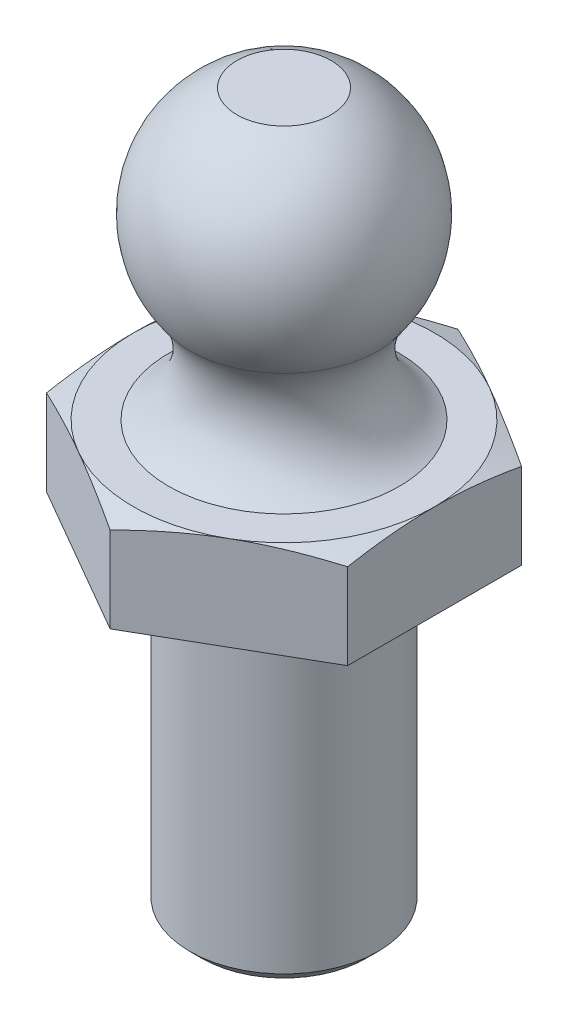
ISO-10303-21;
HEADER;
FILE_DESCRIPTION(('STEP AP214'),'2;1');
FILE_NAME('part.step','',(''),(''),'','','');
FILE_SCHEMA(('AUTOMOTIVE_DESIGN { 1 0 10303 214 1 1 1 1 }'));
ENDSEC;
DATA;
#1=APPLICATION_CONTEXT('core data for automotive mechanical design processes');
#2=APPLICATION_PROTOCOL_DEFINITION('international standard','automotive_design',2000,#1);
#3=PRODUCT_CONTEXT('',#1,'mechanical');
#4=PRODUCT('Part','Part','',(#3));
#5=PRODUCT_RELATED_PRODUCT_CATEGORY('part','',(#4));
#6=PRODUCT_DEFINITION_FORMATION('','',#4);
#7=PRODUCT_DEFINITION_CONTEXT('part definition',#1,'design');
#8=PRODUCT_DEFINITION('design','',#6,#7);
#9=PRODUCT_DEFINITION_SHAPE('','',#8);
#10=(LENGTH_UNIT() NAMED_UNIT(*) SI_UNIT(.MILLI.,.METRE.));
#11=(NAMED_UNIT(*) PLANE_ANGLE_UNIT() SI_UNIT($,.RADIAN.));
#12=(NAMED_UNIT(*) SI_UNIT($,.STERADIAN.) SOLID_ANGLE_UNIT());
#13=UNCERTAINTY_MEASURE_WITH_UNIT(LENGTH_MEASURE(1.E-05),#10,'distance_accuracy_value','');
#14=(GEOMETRIC_REPRESENTATION_CONTEXT(3) GLOBAL_UNCERTAINTY_ASSIGNED_CONTEXT((#13)) GLOBAL_UNIT_ASSIGNED_CONTEXT((#10,
#11,#12)) REPRESENTATION_CONTEXT('',''));
#15=CARTESIAN_POINT('',(0.,0.,0.));
#16=DIRECTION('',(0.,0.,1.));
#17=DIRECTION('',(1.,0.,0.));
#18=AXIS2_PLACEMENT_3D('',#15,#16,#17);
#19=CARTESIAN_POINT('',(0.,4.58936333922042,-193.548));
#20=DIRECTION('',(0.,-1.,0.));
#21=DIRECTION('',(0.,0.,-1.));
#22=AXIS2_PLACEMENT_3D('',#19,#20,#21);
#23=PLANE('',#22);
#24=CARTESIAN_POINT('',(0.,4.58936333922042,-191.563625000001));
#25=CARTESIAN_POINT('',(-0.0557150271613897,4.58936333922042,-191.563625334105));
#26=CARTESIAN_POINT('',(-0.111440293868772,4.58936333922044,-191.565973553882));
#27=CARTESIAN_POINT('',(-0.222505728996802,4.5893633392204,-191.575351160161));
#28=CARTESIAN_POINT('',(-0.277845778848989,4.58936333922033,-191.58238192869));
#29=CARTESIAN_POINT('',(-0.387830036197576,4.58936333922051,-191.601093020423));
#30=CARTESIAN_POINT('',(-0.442472996340412,4.58936333922076,-191.612780724264));
#31=CARTESIAN_POINT('',(-0.550610426029016,4.58936333922008,-191.640725048325));
#32=CARTESIAN_POINT('',(-0.604103925489515,4.58936333921917,-191.656985376249));
#33=CARTESIAN_POINT('',(-0.762058424801336,4.58936333921834,-191.71240089667));
#34=CARTESIAN_POINT('',(-0.864259248372629,4.58936333922034,-191.758236141338));
#35=CARTESIAN_POINT('',(-1.05950239924729,4.5893633392205,-191.866435915959));
#36=CARTESIAN_POINT('',(-1.15254437821291,4.58936333921867,-191.928801074261));
#37=CARTESIAN_POINT('',(-1.28322206445982,4.58936333921933,-192.033334964534));
#38=CARTESIAN_POINT('',(-1.32532503132006,4.58936333922012,-192.07003822172));
#39=CARTESIAN_POINT('',(-1.40625289158326,4.58936333922072,-192.14681978546));
#40=CARTESIAN_POINT('',(-1.44508090640442,4.58936333922052,-192.18689480384));
#41=CARTESIAN_POINT('',(-1.55631282469814,4.58936333922021,-192.311857125379));
#42=CARTESIAN_POINT('',(-1.62349286810965,4.58936333922036,-192.401504351364));
#43=CARTESIAN_POINT('',(-1.74180907533186,4.58936333922047,-192.590756265847));
#44=CARTESIAN_POINT('',(-1.79294584411017,4.58936333922043,-192.690360578693));
#45=CARTESIAN_POINT('',(-1.87778082462843,4.58936333922041,-192.89675165674));
#46=CARTESIAN_POINT('',(-1.91147922261833,4.58936333922042,-193.003538345218));
#47=CARTESIAN_POINT('',(-1.96046714043071,4.58936333922043,-193.221251046382));
#48=CARTESIAN_POINT('',(-1.97575656194144,4.58936333922042,-193.332177081172));
#49=CARTESIAN_POINT('',(-1.98749697381172,4.58936333922042,-193.5550216405));
#50=CARTESIAN_POINT('',(-1.98394796417128,4.58936333922042,-193.666940165039));
#51=CARTESIAN_POINT('',(-1.95810782876371,4.58936333922042,-193.888595130564));
#52=CARTESIAN_POINT('',(-1.93581680308656,4.58936333922042,-193.998331583201));
#53=CARTESIAN_POINT('',(-1.87313840919942,4.58936333922042,-194.212494301612));
#54=CARTESIAN_POINT('',(-1.83275084770853,4.58936333922042,-194.316920510655));
#55=CARTESIAN_POINT('',(-1.73497564480215,4.58936333922042,-194.517557052002));
#56=CARTESIAN_POINT('',(-1.67758736229559,4.58936333922042,-194.6137670743));
#57=CARTESIAN_POINT('',(-1.58010187505837,4.58936333922042,-194.749725528358));
#58=CARTESIAN_POINT('',(-1.54569976982593,4.58936333922042,-194.793658625092));
#59=CARTESIAN_POINT('',(-1.47328789237,4.58936333922042,-194.878518787126));
#60=CARTESIAN_POINT('',(-1.43527467049677,4.58936333922042,-194.919442910443));
#61=CARTESIAN_POINT('',(-1.31630450772369,4.58936333922042,-195.037129325412));
#62=CARTESIAN_POINT('',(-1.23033074208007,4.58936333922042,-195.108925804719));
#63=CARTESIAN_POINT('',(-1.04753774311359,4.58936333922042,-195.237042153092));
#64=CARTESIAN_POINT('',(-0.95071892222504,4.58936333922042,-195.293362610425));
#65=CARTESIAN_POINT('',(-0.799461739080962,4.58936333922042,-195.365068735016));
#66=CARTESIAN_POINT('',(-0.74797296058449,4.58936333922042,-195.386859981829));
#67=CARTESIAN_POINT('',(-0.643370474447544,4.58936333922042,-195.426012361589));
#68=CARTESIAN_POINT('',(-0.590258121116439,4.58936333922042,-195.443377079781));
#69=CARTESIAN_POINT('',(-0.482848831158081,4.58936333922042,-195.473541400576));
#70=CARTESIAN_POINT('',(-0.42855391051418,4.58936333922042,-195.48634821189));
#71=CARTESIAN_POINT('',(-0.319088693754494,4.58936333922042,-195.507344323422));
#72=CARTESIAN_POINT('',(-0.263918660769994,4.58936333922041,-195.515534985558));
#73=CARTESIAN_POINT('',(-0.173885932530527,4.58936333922042,-195.525048560543));
#74=CARTESIAN_POINT('',(-0.139167385842281,4.58936333922042,-195.527795105813));
#75=CARTESIAN_POINT('',(-0.0696338924846435,4.58936333922042,-195.53145842994));
#76=CARTESIAN_POINT('',(-0.0348189458152521,4.58936333922042,-195.532375208797));
#77=CARTESIAN_POINT('',(0.0557150271613863,4.58936333922042,-195.532374665895));
#78=CARTESIAN_POINT('',(0.111440293868767,4.58936333922044,-195.530026446118));
#79=CARTESIAN_POINT('',(0.222505728996797,4.5893633392204,-195.520648839839));
#80=CARTESIAN_POINT('',(0.277845778848985,4.58936333922033,-195.51361807131));
#81=CARTESIAN_POINT('',(0.387830036197573,4.58936333922051,-195.494906979577));
#82=CARTESIAN_POINT('',(0.442472996340409,4.58936333922076,-195.483219275736));
#83=CARTESIAN_POINT('',(0.550610426029014,4.58936333922008,-195.455274951675));
#84=CARTESIAN_POINT('',(0.604103925489514,4.58936333921917,-195.439014623751));
#85=CARTESIAN_POINT('',(0.762058424801334,4.58936333921834,-195.38359910333));
#86=CARTESIAN_POINT('',(0.864259248372627,4.58936333922034,-195.337763858662));
#87=CARTESIAN_POINT('',(1.05950239924729,4.5893633392205,-195.229564084041));
#88=CARTESIAN_POINT('',(1.15254437821291,4.58936333921866,-195.167198925739));
#89=CARTESIAN_POINT('',(1.28322206445983,4.58936333921933,-195.062665035466));
#90=CARTESIAN_POINT('',(1.32532503132008,4.58936333922012,-195.02596177828));
#91=CARTESIAN_POINT('',(1.40625289158329,4.58936333922072,-194.94918021454));
#92=CARTESIAN_POINT('',(1.44508090640445,4.58936333922052,-194.90910519616));
#93=CARTESIAN_POINT('',(1.55631282469816,4.58936333922021,-194.784142874621));
#94=CARTESIAN_POINT('',(1.62349286810966,4.58936333922036,-194.694495648636));
#95=CARTESIAN_POINT('',(1.74180907533186,4.58936333922048,-194.505243734152));
#96=CARTESIAN_POINT('',(1.79294584411017,4.58936333922043,-194.405639421307));
#97=CARTESIAN_POINT('',(1.87778082462844,4.58936333922041,-194.19924834326));
#98=CARTESIAN_POINT('',(1.91147922261833,4.58936333922042,-194.092461654782));
#99=CARTESIAN_POINT('',(1.96046714043071,4.58936333922043,-193.874748953618));
#100=CARTESIAN_POINT('',(1.97575656194144,4.58936333922042,-193.763822918828));
#101=CARTESIAN_POINT('',(1.98749697381172,4.58936333922042,-193.5409783595));
#102=CARTESIAN_POINT('',(1.98394796417128,4.58936333922042,-193.429059834961));
#103=CARTESIAN_POINT('',(1.95810782876371,4.58936333922042,-193.207404869436));
#104=CARTESIAN_POINT('',(1.93581680308656,4.58936333922042,-193.097668416799));
#105=CARTESIAN_POINT('',(1.87313840919942,4.58936333922042,-192.883505698388));
#106=CARTESIAN_POINT('',(1.83275084770853,4.58936333922042,-192.779079489345));
#107=CARTESIAN_POINT('',(1.73497564480215,4.58936333922042,-192.578442947998));
#108=CARTESIAN_POINT('',(1.67758736229559,4.58936333922042,-192.4822329257));
#109=CARTESIAN_POINT('',(1.58010187505837,4.58936333922042,-192.346274471642));
#110=CARTESIAN_POINT('',(1.54569976982593,4.58936333922042,-192.302341374908));
#111=CARTESIAN_POINT('',(1.47328789236999,4.58936333922042,-192.217481212874));
#112=CARTESIAN_POINT('',(1.43527467049677,4.58936333922042,-192.176557089557));
#113=CARTESIAN_POINT('',(1.31630450772369,4.58936333922042,-192.058870674588));
#114=CARTESIAN_POINT('',(1.23033074208008,4.58936333922042,-191.98707419528));
#115=CARTESIAN_POINT('',(1.0475377431136,4.58936333922042,-191.858957846908));
#116=CARTESIAN_POINT('',(0.950718922225044,4.58936333922041,-191.802637389575));
#117=CARTESIAN_POINT('',(0.799461739080965,4.58936333922042,-191.730931264984));
#118=CARTESIAN_POINT('',(0.747972960584492,4.58936333922042,-191.709140018171));
#119=CARTESIAN_POINT('',(0.643370474447547,4.58936333922042,-191.669987638411));
#120=CARTESIAN_POINT('',(0.590258121116442,4.58936333922042,-191.652622920219));
#121=CARTESIAN_POINT('',(0.482848831158084,4.58936333922042,-191.622458599424));
#122=CARTESIAN_POINT('',(0.428553910514183,4.58936333922042,-191.60965178811));
#123=CARTESIAN_POINT('',(0.319088693754497,4.58936333922042,-191.588655676578));
#124=CARTESIAN_POINT('',(0.263918660769996,4.58936333922042,-191.580465014442));
#125=CARTESIAN_POINT('',(0.173885932530529,4.58936333922042,-191.570951439457));
#126=CARTESIAN_POINT('',(0.139167385842283,4.58936333922042,-191.568204894187));
#127=CARTESIAN_POINT('',(0.0696338924846447,4.58936333922042,-191.56454157006));
#128=CARTESIAN_POINT('',(0.034818945815252,4.58936333922042,-191.563624791203));
#129=CARTESIAN_POINT('',(0.,4.58936333922042,-191.563625000001));
#130=B_SPLINE_CURVE_WITH_KNOTS('',3,(#24,#25,#26,#27,#28,#29,#30,#31,#32,#33,#34,#35,#36,#37,
#38,#39,#40,#41,#42,#43,#44,#45,#46,#47,#48,#49,#50,#51,#52,#53,#54,#55,#56,#57,#58,#59,#60,#61,
#62,#63,#64,#65,#66,#67,#68,#69,#70,#71,#72,#73,#74,#75,#76,#77,#78,#79,#80,#81,#82,#83,#84,#85,
#86,#87,#88,#89,#90,#91,#92,#93,#94,#95,#96,#97,#98,#99,#100,#101,#102,#103,#104,#105,#106,#107,
#108,#109,#110,#111,#112,#113,#114,#115,#116,#117,#118,#119,#120,#121,#122,#123,#124,#125,#126,
#127,#128,#129),.UNSPECIFIED.,.T.,.F.,(4,2,2,2,2,2,2,2,2,2,2,2,2,2,2,2,2,2,2,2,2,2,2,2,2,2,2,2,
2,2,2,2,2,2,2,2,2,2,2,2,2,2,2,2,2,2,2,2,2,2,2,2,4),(0.,0.167113026850752,0.334275398010994,
0.501703760384196,0.669268275182528,1.00359854453386,1.33794152453783,1.50533207164408,
1.67256122905135,2.00691224859852,2.34125065875884,2.67558549795511,3.00992212263343,
3.34425874731176,3.67859358650808,4.01293199666835,4.34728301621501,4.51451217362211,
4.68190272072821,5.01624570073239,5.350575970084,5.51814048488257,5.68556884725596,
5.85273121841631,6.01984424526719,6.12428105026207,6.22871785525696,6.39583088210771,
6.56299325326795,6.73042161564115,6.89798613043949,7.23231639979082,7.56665937979479,
7.73404992690108,7.90127908430835,8.23563010385551,8.56996851401581,8.90430335321204,
9.23863997789039,9.57297660256872,9.90731144176504,10.2416498519253,10.576000871472,
10.7432300288791,10.9106205759852,11.2449635559894,11.579293825341,11.7468583401395,
11.9142867025129,12.0814490736733,12.2485621005241,12.352998905519,12.4574357105139),.UNSPECIFIED.);
#131=CARTESIAN_POINT('',(0.,4.58936333922042,-191.563625000001));
#132=VERTEX_POINT('',#131);
#133=EDGE_CURVE('E20',#132,#132,#130,.T.);
#134=ORIENTED_EDGE('',*,*,#133,.F.);
#135=EDGE_LOOP('',(#134));
#136=FACE_BOUND('',#135,.T.);
#137=ADVANCED_FACE('F16',(#136),#23,.F.);
#138=CARTESIAN_POINT('',(0.,0.,-193.548));
#139=DIRECTION('',(0.,0.,-1.));
#140=DIRECTION('',(0.,-1.,0.));
#141=AXIS2_PLACEMENT_3D('',#138,#139,#140);
#142=SPHERICAL_SURFACE('',#141,5.00000000000032);
#143=CARTESIAN_POINT('',(0.,0.,-198.548));
#144=VERTEX_POINT('',#143);
#145=VERTEX_LOOP('',#144);
#146=FACE_BOUND('',#145,.T.);
#147=ORIENTED_EDGE('',*,*,#133,.T.);
#148=EDGE_LOOP('',(#147));
#149=FACE_BOUND('',#148,.T.);
#150=CARTESIAN_POINT('',(0.,0.,-188.548));
#151=VERTEX_POINT('',#150);
#152=VERTEX_LOOP('',#151);
#153=FACE_BOUND('',#152,.T.);
#154=CARTESIAN_POINT('',(0.,-3.04122071502537,-193.548));
#155=DIRECTION('',(0.,1.,0.));
#156=DIRECTION('',(0.,0.,1.));
#157=AXIS2_PLACEMENT_3D('',#154,#155,#156);
#158=CIRCLE('',#157,3.96874999999833);
#159=CARTESIAN_POINT('',(0.,-3.04122071502537,-189.579250000002));
#160=VERTEX_POINT('',#159);
#161=EDGE_CURVE('E375',#160,#160,#158,.T.);
#162=ORIENTED_EDGE('',*,*,#161,.T.);
#163=EDGE_LOOP('',(#162));
#164=FACE_BOUND('',#163,.T.);
#165=ADVANCED_FACE('F277',(#146,#149,#153,#164),#142,.T.);
#166=CARTESIAN_POINT('',(0.,-25.4799999999946,-193.548));
#167=DIRECTION('',(0.,1.,0.));
#168=DIRECTION('',(0.,0.,1.));
#169=AXIS2_PLACEMENT_3D('',#166,#167,#168);
#170=PLANE('',#169);
#171=CARTESIAN_POINT('',(0.,-25.4800000000939,-193.548));
#172=DIRECTION('',(0.,1.,0.));
#173=DIRECTION('',(0.,0.,1.));
#174=AXIS2_PLACEMENT_3D('',#171,#172,#173);
#175=CIRCLE('',#174,3.46074999993107);
#176=CARTESIAN_POINT('',(0.,-25.4800000000939,-190.087250000069));
#177=VERTEX_POINT('',#176);
#178=EDGE_CURVE('E373',#177,#177,#175,.T.);
#179=ORIENTED_EDGE('',*,*,#178,.F.);
#180=EDGE_LOOP('',(#179));
#181=FACE_BOUND('',#180,.T.);
#182=ADVANCED_FACE('F271',(#181),#170,.F.);
#183=CARTESIAN_POINT('',(0.,-4.91743762070326,-193.548));
#184=DIRECTION('',(0.,1.,0.));
#185=DIRECTION('',(0.,0.,1.));
#186=AXIS2_PLACEMENT_3D('',#183,#184,#185);
#187=TOROIDAL_SURFACE('',#186,6.29895176409567,2.99166009742984);
#188=ORIENTED_EDGE('',*,*,#161,.F.);
#189=EDGE_LOOP('',(#188));
#190=FACE_BOUND('',#189,.T.);
#191=CARTESIAN_POINT('',(0.,-7.54124999999968,-193.548));
#192=DIRECTION('',(0.,1.,0.));
#193=DIRECTION('',(0.,0.,1.));
#194=AXIS2_PLACEMENT_3D('',#191,#192,#193);
#195=CIRCLE('',#194,4.8617187500006);
#196=CARTESIAN_POINT('',(0.,-7.54124999999968,-188.686281249999));
#197=VERTEX_POINT('',#196);
#198=EDGE_CURVE('E370',#197,#197,#195,.T.);
#199=ORIENTED_EDGE('',*,*,#198,.T.);
#200=EDGE_LOOP('',(#199));
#201=FACE_BOUND('',#200,.T.);
#202=ADVANCED_FACE('F266',(#190,#201),#187,.F.);
#203=CARTESIAN_POINT('',(0.,-24.9720000001616,-193.548));
#204=DIRECTION('',(0.,1.,0.));
#205=DIRECTION('',(0.,0.,1.));
#206=AXIS2_PLACEMENT_3D('',#203,#204,#205);
#207=CONICAL_SURFACE('',#206,3.96874999986335,0.785398163397448);
#208=CARTESIAN_POINT('',(0.,-24.9719999999997,-193.548));
#209=DIRECTION('',(0.,1.,0.));
#210=DIRECTION('',(0.,0.,1.));
#211=AXIS2_PLACEMENT_3D('',#208,#209,#210);
#212=CIRCLE('',#211,3.96875);
#213=CARTESIAN_POINT('',(0.,-24.9719999999997,-189.57925));
#214=VERTEX_POINT('',#213);
#215=EDGE_CURVE('E116',#214,#214,#212,.T.);
#216=ORIENTED_EDGE('',*,*,#215,.F.);
#217=EDGE_LOOP('',(#216));
#218=FACE_BOUND('',#217,.T.);
#219=ORIENTED_EDGE('',*,*,#178,.T.);
#220=EDGE_LOOP('',(#219));
#221=FACE_BOUND('',#220,.T.);
#222=ADVANCED_FACE('F262',(#218,#221),#207,.T.);
#223=CARTESIAN_POINT('',(0.,-7.54124999999968,-199.898));
#224=DIRECTION('',(0.,-1.,0.));
#225=DIRECTION('',(0.,0.,-1.));
#226=AXIS2_PLACEMENT_3D('',#223,#224,#225);
#227=PLANE('',#226);
#228=ORIENTED_EDGE('',*,*,#198,.F.);
#229=EDGE_LOOP('',(#228));
#230=FACE_BOUND('',#229,.T.);
#231=CARTESIAN_POINT('',(0.,-7.54125000001567,-193.548));
#232=DIRECTION('',(0.,-1.,0.));
#233=DIRECTION('',(0.,0.,-1.));
#234=AXIS2_PLACEMENT_3D('',#231,#232,#233);
#235=CIRCLE('',#234,6.35000000003332);
#236=CARTESIAN_POINT('',(-3.17500000000732,-7.54125000000799,-199.047261314041));
#237=VERTEX_POINT('',#236);
#238=CARTESIAN_POINT('',(3.17500000001056,-7.54125000001035,-199.047261314047));
#239=VERTEX_POINT('',#238);
#240=EDGE_CURVE('E94',#237,#239,#235,.T.);
#241=ORIENTED_EDGE('',*,*,#240,.F.);
#242=CARTESIAN_POINT('',(0.,-7.54125000001568,-193.548));
#243=DIRECTION('',(0.,-1.,0.));
#244=DIRECTION('',(0.,0.,-1.));
#245=AXIS2_PLACEMENT_3D('',#242,#243,#244);
#246=CIRCLE('',#245,6.35000000003333);
#247=CARTESIAN_POINT('',(-6.35000000001666,-7.54125000000961,-193.548));
#248=VERTEX_POINT('',#247);
#249=EDGE_CURVE('E105',#248,#237,#246,.T.);
#250=ORIENTED_EDGE('',*,*,#249,.F.);
#251=CARTESIAN_POINT('',(0.,-7.54125000001568,-193.548));
#252=DIRECTION('',(0.,-1.,0.));
#253=DIRECTION('',(0.,0.,-1.));
#254=AXIS2_PLACEMENT_3D('',#251,#252,#253);
#255=CIRCLE('',#254,6.35000000003333);
#256=CARTESIAN_POINT('',(-3.17500000001054,-7.54125000001035,-188.048738685953));
#257=VERTEX_POINT('',#256);
#258=EDGE_CURVE('E360',#257,#248,#255,.T.);
#259=ORIENTED_EDGE('',*,*,#258,.F.);
#260=CARTESIAN_POINT('',(0.,-7.54125000001568,-193.548));
#261=DIRECTION('',(0.,-1.,0.));
#262=DIRECTION('',(0.,0.,-1.));
#263=AXIS2_PLACEMENT_3D('',#260,#261,#262);
#264=CIRCLE('',#263,6.35000000003333);
#265=CARTESIAN_POINT('',(3.17500000000731,-7.541250000008,-188.048738685959));
#266=VERTEX_POINT('',#265);
#267=EDGE_CURVE('E357',#266,#257,#264,.T.);
#268=ORIENTED_EDGE('',*,*,#267,.F.);
#269=CARTESIAN_POINT('',(0.,-7.54125000001568,-193.548));
#270=DIRECTION('',(0.,-1.,0.));
#271=DIRECTION('',(0.,0.,-1.));
#272=AXIS2_PLACEMENT_3D('',#269,#270,#271);
#273=CIRCLE('',#272,6.35000000003333);
#274=CARTESIAN_POINT('',(6.35000000001666,-7.54125000000961,-193.548));
#275=VERTEX_POINT('',#274);
#276=EDGE_CURVE('E113',#275,#266,#273,.T.);
#277=ORIENTED_EDGE('',*,*,#276,.F.);
#278=CARTESIAN_POINT('',(0.,-7.54125000001567,-193.548));
#279=DIRECTION('',(0.,-1.,0.));
#280=DIRECTION('',(0.,0.,-1.));
#281=AXIS2_PLACEMENT_3D('',#278,#279,#280);
#282=CIRCLE('',#281,6.35000000003332);
#283=EDGE_CURVE('E109',#239,#275,#282,.T.);
#284=ORIENTED_EDGE('',*,*,#283,.F.);
#285=EDGE_LOOP('',(#241,#250,#259,#268,#277,#284));
#286=FACE_BOUND('',#285,.T.);
#287=ADVANCED_FACE('F111',(#230,#286),#227,.F.);
#288=CARTESIAN_POINT('',(0.,-7.900940857553,-193.548));
#289=DIRECTION('',(0.,-1.,0.));
#290=DIRECTION('',(0.,0.,-1.));
#291=AXIS2_PLACEMENT_3D('',#288,#289,#290);
#292=CONICAL_SURFACE('',#291,7.33824250912835,1.2217304764048);
#293=CARTESIAN_POINT('',(6.35,-7.89879558408126,-197.21417420935));
#294=CARTESIAN_POINT('',(6.35,-7.8437040782526,-196.911578781239));
#295=CARTESIAN_POINT('',(6.35,-7.79357612425022,-196.607967299446));
#296=CARTESIAN_POINT('',(6.35,-7.70545754541579,-195.999645877072));
#297=CARTESIAN_POINT('',(6.35,-7.66744191965917,-195.694939529318));
#298=CARTESIAN_POINT('',(6.35,-7.6209863334511,-195.236732818807));
#299=CARTESIAN_POINT('',(6.35,-7.6072602755038,-195.083766535003));
#300=CARTESIAN_POINT('',(6.35,-7.58354791663496,-194.777543212957));
#301=CARTESIAN_POINT('',(6.35,-7.57356158821592,-194.624286176861));
#302=CARTESIAN_POINT('',(6.35,-7.55748986822849,-194.317249617812));
#303=CARTESIAN_POINT('',(6.35,-7.55141256242043,-194.163469669104));
#304=CARTESIAN_POINT('',(6.35,-7.54328606380553,-193.855793962154));
#305=CARTESIAN_POINT('',(6.35,-7.54123712793025,-193.701898197151));
#306=CARTESIAN_POINT('',(6.35,-7.54125000000355,-193.548));
#307=B_SPLINE_CURVE_WITH_KNOTS('',3,(#293,#294,#295,#296,#297,#298,#299,#300,#301,#302,#303,
#304,#305,#306),.UNSPECIFIED.,.F.,.F.,(4,2,2,2,2,2,4),(0.,0.922845074626538,1.84377278576178,
2.30447383635189,2.7651714994307,3.2268190706333,3.68849608500749),.UNSPECIFIED.);
#308=CARTESIAN_POINT('',(6.35000000000361,-7.89879558408284,-197.214174209352));
#309=VERTEX_POINT('',#308);
#310=EDGE_CURVE('E122',#309,#275,#307,.T.);
#311=ORIENTED_EDGE('',*,*,#310,.F.);
#312=CARTESIAN_POINT('',(3.17500000000323,-7.54125000000502,-199.047261314034));
#313=CARTESIAN_POINT('',(3.30827974833331,-7.54123712793173,-198.970312215458));
#314=CARTESIAN_POINT('',(3.44155739036092,-7.54328606380703,-198.893364332956));
#315=CARTESIAN_POINT('',(3.70801236870752,-7.55141256242199,-198.739526479481));
#316=CARTESIAN_POINT('',(3.84118971088138,-7.55748986823008,-198.662636505127));
#317=CARTESIAN_POINT('',(4.10709117090895,-7.57356158821761,-198.509118225602));
#318=CARTESIAN_POINT('',(4.23981565747721,-7.5835479166367,-198.432489707554));
#319=CARTESIAN_POINT('',(4.50501283360117,-7.60726027550566,-198.279378046531));
#320=CARTESIAN_POINT('',(4.63748552129824,-7.62098633345303,-198.202894904628));
#321=CARTESIAN_POINT('',(5.03430417278631,-7.66744191966132,-197.973791549372));
#322=CARTESIAN_POINT('',(5.29818761063587,-7.70545754541812,-197.821438375495));
#323=CARTESIAN_POINT('',(5.82500941607965,-7.79357612425293,-197.517277664307));
#324=CARTESIAN_POINT('',(6.0879446721935,-7.84370407825553,-197.36547192341));
#325=CARTESIAN_POINT('',(6.3500000000072,-7.89879558408441,-197.214174209355));
#326=B_SPLINE_CURVE_WITH_KNOTS('',3,(#312,#313,#314,#315,#316,#317,#318,#319,#320,#321,#322,
#323,#324,#325),.UNSPECIFIED.,.F.,.F.,(4,2,2,2,2,2,4),(0.,0.461677014375309,0.923324585579079,
1.38402224865904,1.8447232992503,2.76565101038787,3.68849608501668),.UNSPECIFIED.);
#327=EDGE_CURVE('E119',#239,#309,#326,.T.);
#328=ORIENTED_EDGE('',*,*,#327,.F.);
#329=ORIENTED_EDGE('',*,*,#283,.T.);
#330=EDGE_LOOP('',(#311,#328,#329));
#331=FACE_BOUND('',#330,.T.);
#332=ADVANCED_FACE('F120',(#331),#292,.T.);
#333=CARTESIAN_POINT('',(0.,-7.900940857553,-193.548));
#334=DIRECTION('',(0.,-1.,0.));
#335=DIRECTION('',(0.,0.,-1.));
#336=AXIS2_PLACEMENT_3D('',#333,#334,#335);
#337=CONICAL_SURFACE('',#336,7.33824250912835,1.2217304764048);
#338=CARTESIAN_POINT('',(6.35000000000139,-7.89879558408048,-189.881825790657));
#339=CARTESIAN_POINT('',(6.08794467218763,-7.84370407825149,-189.730528076601));
#340=CARTESIAN_POINT('',(5.82500941607373,-7.79357612424879,-189.578722335704));
#341=CARTESIAN_POINT('',(5.29818761062984,-7.70545754541379,-189.274561624516));
#342=CARTESIAN_POINT('',(5.03430417278024,-7.66744191965691,-189.122208450639));
#343=CARTESIAN_POINT('',(4.63748552129208,-7.62098633344851,-188.893105095383));
#344=CARTESIAN_POINT('',(4.50501283359498,-7.60726027550111,-188.816621953481));
#345=CARTESIAN_POINT('',(4.23981565747096,-7.58354791663209,-188.663510292457));
#346=CARTESIAN_POINT('',(4.10709117090268,-7.57356158821298,-188.586881774409));
#347=CARTESIAN_POINT('',(3.84118971087506,-7.55748986822542,-188.433363494884));
#348=CARTESIAN_POINT('',(3.70801236870117,-7.55141256241731,-188.35647352053));
#349=CARTESIAN_POINT('',(3.44155739035451,-7.54328606380233,-188.202635667055));
#350=CARTESIAN_POINT('',(3.30827974832686,-7.54123712792702,-188.125687784553));
#351=CARTESIAN_POINT('',(3.17499999999674,-7.54125000000031,-188.048738685977));
#352=B_SPLINE_CURVE_WITH_KNOTS('',3,(#338,#339,#340,#341,#342,#343,#344,#345,#346,#347,#348,
#349,#350,#351),.UNSPECIFIED.,.F.,.F.,(4,2,2,2,2,2,4),(0.,0.922845074629063,1.84377278576682,
2.3044738363582,2.76517149943824,3.22681907064212,3.68849608501755),.UNSPECIFIED.);
#353=CARTESIAN_POINT('',(6.35000000000069,-7.89879558408047,-189.881825790656));
#354=VERTEX_POINT('',#353);
#355=EDGE_CURVE('E231',#354,#266,#352,.T.);
#356=ORIENTED_EDGE('',*,*,#355,.F.);
#357=CARTESIAN_POINT('',(6.35,-7.54125000000355,-193.548));
#358=CARTESIAN_POINT('',(6.35,-7.54123712793024,-193.394101802849));
#359=CARTESIAN_POINT('',(6.35,-7.54328606380552,-193.240206037846));
#360=CARTESIAN_POINT('',(6.35,-7.55141256242041,-192.932530330897));
#361=CARTESIAN_POINT('',(6.35,-7.55748986822845,-192.778750382189));
#362=CARTESIAN_POINT('',(6.35,-7.57356158821584,-192.471713823141));
#363=CARTESIAN_POINT('',(6.35,-7.58354791663485,-192.318456787045));
#364=CARTESIAN_POINT('',(6.35,-7.60726027550364,-192.012233464999));
#365=CARTESIAN_POINT('',(6.35,-7.62098633345091,-191.859267181195));
#366=CARTESIAN_POINT('',(6.35,-7.66744191965887,-191.401060470684));
#367=CARTESIAN_POINT('',(6.35,-7.70545754541541,-191.096354122931));
#368=CARTESIAN_POINT('',(6.35,-7.79357612424964,-190.488032700558));
#369=CARTESIAN_POINT('',(6.35,-7.84370407825191,-190.184421218765));
#370=CARTESIAN_POINT('',(6.35,-7.89879558408047,-189.881825790655));
#371=B_SPLINE_CURVE_WITH_KNOTS('',3,(#357,#358,#359,#360,#361,#362,#363,#364,#365,#366,#367,
#368,#369,#370),.UNSPECIFIED.,.F.,.F.,(4,2,2,2,2,2,4),(0.,0.461677014373637,0.923324585575702,
1.38402224865393,1.8447232992435,2.76565101037764,3.68849608500309),.UNSPECIFIED.);
#372=EDGE_CURVE('E247',#275,#354,#371,.T.);
#373=ORIENTED_EDGE('',*,*,#372,.F.);
#374=ORIENTED_EDGE('',*,*,#276,.T.);
#375=EDGE_LOOP('',(#356,#373,#374));
#376=FACE_BOUND('',#375,.T.);
#377=ADVANCED_FACE('F213',(#376),#337,.T.);
#378=CARTESIAN_POINT('',(0.,-7.900940857553,-193.548));
#379=DIRECTION('',(0.,-1.,0.));
#380=DIRECTION('',(0.,0.,-1.));
#381=AXIS2_PLACEMENT_3D('',#378,#379,#380);
#382=CONICAL_SURFACE('',#381,7.33824250912835,1.2217304764048);
#383=CARTESIAN_POINT('',(-1.05423852089981E-11,-7.89879558408159,-186.215651581293));
#384=CARTESIAN_POINT('',(-0.262055327823322,-7.84370407825307,-186.366949295348));
#385=CARTESIAN_POINT('',(-0.52499058393626,-7.79357612425083,-186.518755036245));
#386=CARTESIAN_POINT('',(-1.05181238937819,-7.70545754541665,-186.822915747431));
#387=CARTESIAN_POINT('',(-1.31569582722681,-7.66744191966015,-186.975268921308));
#388=CARTESIAN_POINT('',(-1.71251447871345,-7.62098633345224,-187.204372276563));
#389=CARTESIAN_POINT('',(-1.84498716641005,-7.60726027550498,-187.280855418465));
#390=CARTESIAN_POINT('',(-2.11018434253306,-7.58354791663623,-187.433967079488));
#391=CARTESIAN_POINT('',(-2.24290882910085,-7.57356158821723,-187.510595597536));
#392=CARTESIAN_POINT('',(-2.50881028912747,-7.55748986822987,-187.66411387706));
#393=CARTESIAN_POINT('',(-2.64198763130086,-7.55141256242184,-187.741003851414));
#394=CARTESIAN_POINT('',(-2.9084426096465,-7.54328606380698,-187.894841704889));
#395=CARTESIAN_POINT('',(-3.04172025167364,-7.54123712793171,-187.97178958739));
#396=CARTESIAN_POINT('',(-3.17500000000323,-7.54125000000503,-188.048738685966));
#397=B_SPLINE_CURVE_WITH_KNOTS('',3,(#383,#384,#385,#386,#387,#388,#389,#390,#391,#392,#393,
#394,#395,#396),.UNSPECIFIED.,.F.,.F.,(4,2,2,2,2,2,4),(0.,0.922845074625536,1.84377278575973,
2.30447383634934,2.76517149942764,3.22681907062975,3.6884960850034),.UNSPECIFIED.);
#398=CARTESIAN_POINT('',(0.,-7.89879558408302,-186.215651581335));
#399=VERTEX_POINT('',#398);
#400=EDGE_CURVE('E217',#399,#257,#397,.T.);
#401=ORIENTED_EDGE('',*,*,#400,.F.);
#402=CARTESIAN_POINT('',(3.17499999999675,-7.54125000000031,-188.048738685977));
#403=CARTESIAN_POINT('',(3.04172025166699,-7.541237127927,-187.971789587401));
#404=CARTESIAN_POINT('',(2.90844260963969,-7.54328606380227,-187.8948417049));
#405=CARTESIAN_POINT('',(2.64198763129372,-7.55141256241717,-187.741003851425));
#406=CARTESIAN_POINT('',(2.50881028912018,-7.55748986822523,-187.664113877071));
#407=CARTESIAN_POINT('',(2.24290882909324,-7.57356158821266,-187.510595597547));
#408=CARTESIAN_POINT('',(2.11018434252529,-7.5835479166317,-187.433967079499));
#409=CARTESIAN_POINT('',(1.84498716640197,-7.60726027550056,-187.280855418476));
#410=CARTESIAN_POINT('',(1.71251447870522,-7.62098633344787,-187.204372276574));
#411=CARTESIAN_POINT('',(1.31569582721811,-7.66744191965598,-186.975268921318));
#412=CARTESIAN_POINT('',(1.05181238936918,-7.70545754541264,-186.822915747441));
#413=CARTESIAN_POINT('',(0.524990583926622,-7.79357612424715,-186.518755036254));
#414=CARTESIAN_POINT('',(0.262055327813382,-7.84370407824958,-186.366949295358));
#415=CARTESIAN_POINT('',(3.05430504209388E-13,-7.8987955840783,-186.215651581302));
#416=B_SPLINE_CURVE_WITH_KNOTS('',3,(#402,#403,#404,#405,#406,#407,#408,#409,#410,#411,#412,
#413,#414,#415),.UNSPECIFIED.,.F.,.F.,(4,2,2,2,2,2,4),(0.,0.461677014374219,0.923324585576885,
1.38402224865575,1.84472329924589,2.76565101038124,3.68849608500789),.UNSPECIFIED.);
#417=EDGE_CURVE('E223',#266,#399,#416,.T.);
#418=ORIENTED_EDGE('',*,*,#417,.F.);
#419=ORIENTED_EDGE('',*,*,#267,.T.);
#420=EDGE_LOOP('',(#401,#418,#419));
#421=FACE_BOUND('',#420,.T.);
#422=ADVANCED_FACE('F207',(#421),#382,.T.);
#423=CARTESIAN_POINT('',(0.,-7.900940857553,-193.548));
#424=DIRECTION('',(0.,-1.,0.));
#425=DIRECTION('',(0.,0.,-1.));
#426=AXIS2_PLACEMENT_3D('',#423,#424,#425);
#427=CONICAL_SURFACE('',#426,7.33824250912835,1.2217304764048);
#428=CARTESIAN_POINT('',(-3.17500000000323,-7.54125000000503,-188.048738685966));
#429=CARTESIAN_POINT('',(-3.30827974833329,-7.54123712793174,-188.125687784542));
#430=CARTESIAN_POINT('',(-3.44155739036091,-7.54328606380704,-188.202635667043));
#431=CARTESIAN_POINT('',(-3.70801236870751,-7.551412562422,-188.356473520519));
#432=CARTESIAN_POINT('',(-3.84118971088138,-7.55748986823009,-188.433363494873));
#433=CARTESIAN_POINT('',(-4.10709117090895,-7.57356158821761,-188.586881774398));
#434=CARTESIAN_POINT('',(-4.2398156574772,-7.5835479166367,-188.663510292446));
#435=CARTESIAN_POINT('',(-4.50501283360116,-7.60726027550566,-188.816621953469));
#436=CARTESIAN_POINT('',(-4.63748552129823,-7.62098633345303,-188.893105095372));
#437=CARTESIAN_POINT('',(-5.03430417278631,-7.66744191966133,-189.122208450628));
#438=CARTESIAN_POINT('',(-5.29818761063586,-7.70545754541812,-189.274561624505));
#439=CARTESIAN_POINT('',(-5.82500941607964,-7.79357612425294,-189.578722335693));
#440=CARTESIAN_POINT('',(-6.0879446721935,-7.84370407825553,-189.73052807659));
#441=CARTESIAN_POINT('',(-6.3500000000072,-7.89879558408442,-189.881825790645));
#442=B_SPLINE_CURVE_WITH_KNOTS('',3,(#428,#429,#430,#431,#432,#433,#434,#435,#436,#437,#438,
#439,#440,#441),.UNSPECIFIED.,.F.,.F.,(4,2,2,2,2,2,4),(0.,0.461677014375301,0.923324585579082,
1.38402224865904,1.8447232992503,2.76565101038784,3.68849608501669),.UNSPECIFIED.);
#443=CARTESIAN_POINT('',(-6.35000000000361,-7.89879558408284,-189.881825790648));
#444=VERTEX_POINT('',#443);
#445=EDGE_CURVE('E197',#257,#444,#442,.T.);
#446=ORIENTED_EDGE('',*,*,#445,.F.);
#447=ORIENTED_EDGE('',*,*,#258,.T.);
#448=CARTESIAN_POINT('',(-6.35,-7.89879558408127,-189.88182579065));
#449=CARTESIAN_POINT('',(-6.35,-7.8437040782526,-190.184421218761));
#450=CARTESIAN_POINT('',(-6.35,-7.79357612425022,-190.488032700554));
#451=CARTESIAN_POINT('',(-6.35,-7.70545754541579,-191.096354122928));
#452=CARTESIAN_POINT('',(-6.35,-7.66744191965917,-191.401060470682));
#453=CARTESIAN_POINT('',(-6.35,-7.6209863334511,-191.859267181193));
#454=CARTESIAN_POINT('',(-6.35,-7.60726027550379,-192.012233464997));
#455=CARTESIAN_POINT('',(-6.35,-7.58354791663495,-192.318456787043));
#456=CARTESIAN_POINT('',(-6.35,-7.57356158821592,-192.471713823139));
#457=CARTESIAN_POINT('',(-6.35,-7.55748986822849,-192.778750382188));
#458=CARTESIAN_POINT('',(-6.35,-7.55141256242043,-192.932530330896));
#459=CARTESIAN_POINT('',(-6.35,-7.54328606380552,-193.240206037846));
#460=CARTESIAN_POINT('',(-6.35,-7.54123712793024,-193.394101802849));
#461=CARTESIAN_POINT('',(-6.35,-7.54125000000355,-193.548));
#462=B_SPLINE_CURVE_WITH_KNOTS('',3,(#448,#449,#450,#451,#452,#453,#454,#455,#456,#457,#458,
#459,#460,#461),.UNSPECIFIED.,.F.,.F.,(4,2,2,2,2,2,4),(0.,0.922845074626595,1.84377278576184,
2.30447383635197,2.76517149943079,3.22681907063338,3.68849608500757),.UNSPECIFIED.);
#463=EDGE_CURVE('E189',#444,#248,#462,.T.);
#464=ORIENTED_EDGE('',*,*,#463,.F.);
#465=EDGE_LOOP('',(#446,#447,#464));
#466=FACE_BOUND('',#465,.T.);
#467=ADVANCED_FACE('F203',(#466),#427,.T.);
#468=CARTESIAN_POINT('',(0.,-7.900940857553,-193.548));
#469=DIRECTION('',(0.,-1.,0.));
#470=DIRECTION('',(0.,0.,-1.));
#471=AXIS2_PLACEMENT_3D('',#468,#469,#470);
#472=CONICAL_SURFACE('',#471,7.33824250912835,1.2217304764048);
#473=CARTESIAN_POINT('',(-6.35,-7.54125000000355,-193.548));
#474=CARTESIAN_POINT('',(-6.35,-7.54123712793024,-193.701898197151));
#475=CARTESIAN_POINT('',(-6.35,-7.54328606380552,-193.855793962154));
#476=CARTESIAN_POINT('',(-6.35,-7.55141256242041,-194.163469669103));
#477=CARTESIAN_POINT('',(-6.35,-7.55748986822845,-194.317249617811));
#478=CARTESIAN_POINT('',(-6.35,-7.57356158821584,-194.624286176859));
#479=CARTESIAN_POINT('',(-6.35,-7.58354791663486,-194.777543212955));
#480=CARTESIAN_POINT('',(-6.35,-7.60726027550364,-195.083766535001));
#481=CARTESIAN_POINT('',(-6.35,-7.62098633345091,-195.236732818805));
#482=CARTESIAN_POINT('',(-6.35,-7.66744191965887,-195.694939529316));
#483=CARTESIAN_POINT('',(-6.35,-7.70545754541541,-195.999645877069));
#484=CARTESIAN_POINT('',(-6.35,-7.79357612424964,-196.607967299442));
#485=CARTESIAN_POINT('',(-6.35,-7.84370407825192,-196.911578781235));
#486=CARTESIAN_POINT('',(-6.35,-7.89879558408047,-197.214174209345));
#487=B_SPLINE_CURVE_WITH_KNOTS('',3,(#473,#474,#475,#476,#477,#478,#479,#480,#481,#482,#483,
#484,#485,#486),.UNSPECIFIED.,.F.,.F.,(4,2,2,2,2,2,4),(0.,0.46167701437361,0.923324585575675,
1.38402224865393,1.84472329924348,2.76565101037759,3.68849608500306),.UNSPECIFIED.);
#488=CARTESIAN_POINT('',(-6.35000000000069,-7.89879558408047,-197.214174209344));
#489=VERTEX_POINT('',#488);
#490=EDGE_CURVE('E183',#248,#489,#487,.T.);
#491=ORIENTED_EDGE('',*,*,#490,.F.);
#492=ORIENTED_EDGE('',*,*,#249,.T.);
#493=CARTESIAN_POINT('',(-6.35000000000137,-7.89879558408047,-197.214174209343));
#494=CARTESIAN_POINT('',(-6.08794467218763,-7.84370407825149,-197.365471923399));
#495=CARTESIAN_POINT('',(-5.82500941607373,-7.79357612424879,-197.517277664296));
#496=CARTESIAN_POINT('',(-5.29818761062984,-7.70545754541379,-197.821438375484));
#497=CARTESIAN_POINT('',(-5.03430417278024,-7.66744191965691,-197.973791549361));
#498=CARTESIAN_POINT('',(-4.63748552129209,-7.62098633344851,-198.202894904617));
#499=CARTESIAN_POINT('',(-4.50501283359499,-7.60726027550111,-198.279378046519));
#500=CARTESIAN_POINT('',(-4.23981565747098,-7.5835479166321,-198.432489707543));
#501=CARTESIAN_POINT('',(-4.10709117090271,-7.57356158821298,-198.509118225591));
#502=CARTESIAN_POINT('',(-3.84118971087508,-7.55748986822542,-198.662636505116));
#503=CARTESIAN_POINT('',(-3.70801236870119,-7.55141256241731,-198.73952647947));
#504=CARTESIAN_POINT('',(-3.44155739035452,-7.54328606380233,-198.893364332945));
#505=CARTESIAN_POINT('',(-3.30827974832687,-7.54123712792702,-198.970312215447));
#506=CARTESIAN_POINT('',(-3.17499999999677,-7.54125000000031,-199.047261314023));
#507=B_SPLINE_CURVE_WITH_KNOTS('',3,(#493,#494,#495,#496,#497,#498,#499,#500,#501,#502,#503,
#504,#505,#506),.UNSPECIFIED.,.F.,.F.,(4,2,2,2,2,2,4),(0.,0.922845074629048,1.8437727857668,
2.30447383635816,2.76517149943821,3.22681907064207,3.68849608501751),.UNSPECIFIED.);
#508=EDGE_CURVE('E159',#489,#237,#507,.T.);
#509=ORIENTED_EDGE('',*,*,#508,.F.);
#510=EDGE_LOOP('',(#491,#492,#509));
#511=FACE_BOUND('',#510,.T.);
#512=ADVANCED_FACE('F148',(#511),#472,.T.);
#513=CARTESIAN_POINT('',(0.,-7.900940857553,-193.548));
#514=DIRECTION('',(0.,-1.,0.));
#515=DIRECTION('',(0.,0.,-1.));
#516=AXIS2_PLACEMENT_3D('',#513,#514,#515);
#517=CONICAL_SURFACE('',#516,7.33824250912835,1.2217304764048);
#518=CARTESIAN_POINT('',(-3.17499999999677,-7.54125000000031,-199.047261314023));
#519=CARTESIAN_POINT('',(-3.0417202516667,-7.541237127927,-199.124210412599));
#520=CARTESIAN_POINT('',(-2.90844260963909,-7.54328606380228,-199.2011582951));
#521=CARTESIAN_POINT('',(-2.6419876312925,-7.55141256241722,-199.354996148576));
#522=CARTESIAN_POINT('',(-2.50881028911865,-7.5574898682253,-199.43188612293));
#523=CARTESIAN_POINT('',(-2.2429088290911,-7.57356158821281,-199.585404402454));
#524=CARTESIAN_POINT('',(-2.11018434252285,-7.5835479166319,-199.662032920503));
#525=CARTESIAN_POINT('',(-1.84498716639891,-7.60726027550086,-199.815144581526));
#526=CARTESIAN_POINT('',(-1.71251447870185,-7.62098633344823,-199.891627723428));
#527=CARTESIAN_POINT('',(-1.31569582721381,-7.66744191965655,-200.120731078684));
#528=CARTESIAN_POINT('',(-1.05181238936428,-7.70545754541337,-200.273084252562));
#529=CARTESIAN_POINT('',(-0.524990583920541,-7.79357612424826,-200.57724496375));
#530=CARTESIAN_POINT('',(-0.262055327806706,-7.84370407825089,-200.729050704646));
#531=CARTESIAN_POINT('',(6.97260716160643E-12,-7.89879558407983,-200.880348418702));
#532=B_SPLINE_CURVE_WITH_KNOTS('',3,(#518,#519,#520,#521,#522,#523,#524,#525,#526,#527,#528,
#529,#530,#531),.UNSPECIFIED.,.F.,.F.,(4,2,2,2,2,2,4),(0.,0.461677014375295,0.92332458557905,
1.38402224865894,1.84472329925019,2.76565101038766,3.68849608501645),.UNSPECIFIED.);
#533=CARTESIAN_POINT('',(5.16446025686364E-12,-7.89879558408135,-200.880348418706));
#534=VERTEX_POINT('',#533);
#535=EDGE_CURVE('E101',#237,#534,#532,.T.);
#536=ORIENTED_EDGE('',*,*,#535,.F.);
#537=ORIENTED_EDGE('',*,*,#240,.T.);
#538=CARTESIAN_POINT('',(3.86187145689073E-12,-7.89879558408298,-200.880348418711));
#539=CARTESIAN_POINT('',(0.262055327817187,-7.84370407825426,-200.729050704655));
#540=CARTESIAN_POINT('',(0.524990583930657,-7.79357612425183,-200.577244963759));
#541=CARTESIAN_POINT('',(1.05181238937368,-7.70545754541732,-200.273084252571));
#542=CARTESIAN_POINT('',(1.31569582722286,-7.66744191966066,-200.120731078694));
#543=CARTESIAN_POINT('',(1.71251447871036,-7.62098633345256,-199.891627723438));
#544=CARTESIAN_POINT('',(1.84498716640724,-7.60726027550525,-199.815144581536));
#545=CARTESIAN_POINT('',(2.11018434253081,-7.5835479166364,-199.662032920513));
#546=CARTESIAN_POINT('',(2.24290882909887,-7.57356158821736,-199.585404402465));
#547=CARTESIAN_POINT('',(2.50881028912604,-7.55748986822993,-199.43188612294));
#548=CARTESIAN_POINT('',(2.64198763129971,-7.55141256242187,-199.354996148586));
#549=CARTESIAN_POINT('',(2.90844260964593,-7.54328606380698,-199.201158295111));
#550=CARTESIAN_POINT('',(3.04172025167335,-7.5412371279317,-199.12421041261));
#551=CARTESIAN_POINT('',(3.17500000000323,-7.54125000000502,-199.047261314034));
#552=B_SPLINE_CURVE_WITH_KNOTS('',3,(#538,#539,#540,#541,#542,#543,#544,#545,#546,#547,#548,
#549,#550,#551),.UNSPECIFIED.,.F.,.F.,(4,2,2,2,2,2,4),(0.,0.922845074627455,1.84377278576366,
2.30447383635424,2.76517149943351,3.22681907063659,3.68849608501124),.UNSPECIFIED.);
#553=EDGE_CURVE('E98',#534,#239,#552,.T.);
#554=ORIENTED_EDGE('',*,*,#553,.F.);
#555=EDGE_LOOP('',(#536,#537,#554));
#556=FACE_BOUND('',#555,.T.);
#557=ADVANCED_FACE('F96',(#556),#517,.T.);
#558=CARTESIAN_POINT('',(0.,11.8583204419807,-200.880348418713));
#559=DIRECTION('',(0.500000000000017,0.,-0.866025403784429));
#560=DIRECTION('',(-0.866025403784429,0.,-0.500000000000017));
#561=AXIS2_PLACEMENT_3D('',#558,#559,#560);
#562=PLANE('',#561);
#563=DIRECTION('',(0.866025403783548,0.,0.500000000001543));
#564=VECTOR('',#563,1.);
#565=CARTESIAN_POINT('',(0.,-11.5099999999997,-200.880348418713));
#566=LINE('',#565,#564);
#567=CARTESIAN_POINT('',(3.23287403791728E-12,-11.5099999999997,-200.880348418707));
#568=VERTEX_POINT('',#567);
#569=CARTESIAN_POINT('',(6.35,-11.5099999999997,-197.214174209346));
#570=VERTEX_POINT('',#569);
#571=EDGE_CURVE('E316',#568,#570,#566,.T.);
#572=ORIENTED_EDGE('',*,*,#571,.F.);
#573=DIRECTION('',(0.,1.,0.));
#574=VECTOR('',#573,1.);
#575=CARTESIAN_POINT('',(6.46704911844154E-12,11.8583204419807,-200.880348418702));
#576=LINE('',#575,#574);
#577=EDGE_CURVE('E128',#534,#568,#576,.F.);
#578=ORIENTED_EDGE('',*,*,#577,.F.);
#579=ORIENTED_EDGE('',*,*,#553,.T.);
#580=ORIENTED_EDGE('',*,*,#327,.T.);
#581=DIRECTION('',(0.,1.,0.));
#582=VECTOR('',#581,1.);
#583=CARTESIAN_POINT('',(6.35,11.8583204419807,-197.214174209344));
#584=LINE('',#583,#582);
#585=EDGE_CURVE('E330',#570,#309,#584,.T.);
#586=ORIENTED_EDGE('',*,*,#585,.F.);
#587=EDGE_LOOP('',(#572,#578,#579,#580,#586));
#588=FACE_BOUND('',#587,.T.);
#589=ADVANCED_FACE('F126',(#588),#562,.T.);
#590=CARTESIAN_POINT('',(6.35,11.8583204419807,-197.214174209344));
#591=DIRECTION('',(1.,0.,0.));
#592=DIRECTION('',(0.,0.,-1.));
#593=AXIS2_PLACEMENT_3D('',#590,#591,#592);
#594=PLANE('',#593);
#595=DIRECTION('',(0.,0.,-1.));
#596=VECTOR('',#595,1.);
#597=CARTESIAN_POINT('',(6.35,-11.5099999999997,-200.880348418713));
#598=LINE('',#597,#596);
#599=CARTESIAN_POINT('',(6.35,-11.5099999999997,-189.881825790656));
#600=VERTEX_POINT('',#599);
#601=EDGE_CURVE('E318',#570,#600,#598,.F.);
#602=ORIENTED_EDGE('',*,*,#601,.F.);
#603=ORIENTED_EDGE('',*,*,#585,.T.);
#604=ORIENTED_EDGE('',*,*,#310,.T.);
#605=ORIENTED_EDGE('',*,*,#372,.T.);
#606=DIRECTION('',(0.,1.,0.));
#607=VECTOR('',#606,1.);
#608=CARTESIAN_POINT('',(6.35,11.8583204419807,-189.881825790656));
#609=LINE('',#608,#607);
#610=EDGE_CURVE('E230',#600,#354,#609,.T.);
#611=ORIENTED_EDGE('',*,*,#610,.F.);
#612=EDGE_LOOP('',(#602,#603,#604,#605,#611));
#613=FACE_BOUND('',#612,.T.);
#614=ADVANCED_FACE('F240',(#613),#594,.T.);
#615=CARTESIAN_POINT('',(6.35,11.8583204419807,-189.881825790656));
#616=DIRECTION('',(0.500000000000017,0.,0.866025403784429));
#617=DIRECTION('',(0.866025403784429,0.,-0.500000000000017));
#618=AXIS2_PLACEMENT_3D('',#615,#616,#617);
#619=PLANE('',#618);
#620=DIRECTION('',(-0.866025403783546,0.,0.500000000001546));
#621=VECTOR('',#620,1.);
#622=CARTESIAN_POINT('',(6.35,-11.5099999999997,-189.881825790656));
#623=LINE('',#622,#621);
#624=CARTESIAN_POINT('',(-2.42805804435077E-12,-11.5099999999997,-186.215651581288));
#625=VERTEX_POINT('',#624);
#626=EDGE_CURVE('E309',#600,#625,#623,.T.);
#627=ORIENTED_EDGE('',*,*,#626,.F.);
#628=ORIENTED_EDGE('',*,*,#610,.T.);
#629=ORIENTED_EDGE('',*,*,#355,.T.);
#630=ORIENTED_EDGE('',*,*,#417,.T.);
#631=DIRECTION('',(0.,1.,0.));
#632=VECTOR('',#631,1.);
#633=CARTESIAN_POINT('',(0.,11.8583204419807,-186.215651581287));
#634=LINE('',#633,#632);
#635=EDGE_CURVE('E196',#625,#399,#634,.T.);
#636=ORIENTED_EDGE('',*,*,#635,.F.);
#637=EDGE_LOOP('',(#627,#628,#629,#630,#636));
#638=FACE_BOUND('',#637,.T.);
#639=ADVANCED_FACE('F237',(#638),#619,.T.);
#640=CARTESIAN_POINT('',(0.,11.8583204419807,-186.215651581287));
#641=DIRECTION('',(-0.500000000000017,0.,0.866025403784429));
#642=DIRECTION('',(0.866025403784429,0.,0.500000000000017));
#643=AXIS2_PLACEMENT_3D('',#640,#641,#642);
#644=PLANE('',#643);
#645=DIRECTION('',(-0.866025403783546,0.,-0.500000000001546));
#646=VECTOR('',#645,1.);
#647=CARTESIAN_POINT('',(0.,-11.5099999999997,-186.215651581287));
#648=LINE('',#647,#646);
#649=CARTESIAN_POINT('',(-6.35,-11.5099999999997,-189.881825790653));
#650=VERTEX_POINT('',#649);
#651=EDGE_CURVE('E305',#625,#650,#648,.T.);
#652=ORIENTED_EDGE('',*,*,#651,.F.);
#653=ORIENTED_EDGE('',*,*,#635,.T.);
#654=ORIENTED_EDGE('',*,*,#400,.T.);
#655=ORIENTED_EDGE('',*,*,#445,.T.);
#656=DIRECTION('',(0.,1.,0.));
#657=VECTOR('',#656,1.);
#658=CARTESIAN_POINT('',(-6.35,11.8583204419807,-189.881825790656));
#659=LINE('',#658,#657);
#660=EDGE_CURVE('E341',#650,#444,#659,.T.);
#661=ORIENTED_EDGE('',*,*,#660,.F.);
#662=EDGE_LOOP('',(#652,#653,#654,#655,#661));
#663=FACE_BOUND('',#662,.T.);
#664=ADVANCED_FACE('F179',(#663),#644,.T.);
#665=CARTESIAN_POINT('',(-6.35,11.8583204419807,-189.881825790656));
#666=DIRECTION('',(-1.,0.,0.));
#667=DIRECTION('',(0.,0.,1.));
#668=AXIS2_PLACEMENT_3D('',#665,#666,#667);
#669=PLANE('',#668);
#670=DIRECTION('',(0.,0.,-1.));
#671=VECTOR('',#670,1.);
#672=CARTESIAN_POINT('',(-6.35,-11.5099999999997,-200.880348418713));
#673=LINE('',#672,#671);
#674=CARTESIAN_POINT('',(-6.35,-11.5099999999997,-197.214174209344));
#675=VERTEX_POINT('',#674);
#676=EDGE_CURVE('E301',#650,#675,#673,.T.);
#677=ORIENTED_EDGE('',*,*,#676,.F.);
#678=ORIENTED_EDGE('',*,*,#660,.T.);
#679=ORIENTED_EDGE('',*,*,#463,.T.);
#680=ORIENTED_EDGE('',*,*,#490,.T.);
#681=DIRECTION('',(0.,1.,0.));
#682=VECTOR('',#681,1.);
#683=CARTESIAN_POINT('',(-6.35,11.8583204419807,-197.214174209344));
#684=LINE('',#683,#682);
#685=EDGE_CURVE('E38',#675,#489,#684,.T.);
#686=ORIENTED_EDGE('',*,*,#685,.F.);
#687=EDGE_LOOP('',(#677,#678,#679,#680,#686));
#688=FACE_BOUND('',#687,.T.);
#689=ADVANCED_FACE('F172',(#688),#669,.T.);
#690=CARTESIAN_POINT('',(-6.35,11.8583204419807,-197.214174209344));
#691=DIRECTION('',(-0.500000000000017,0.,-0.866025403784429));
#692=DIRECTION('',(-0.866025403784429,0.,0.500000000000017));
#693=AXIS2_PLACEMENT_3D('',#690,#691,#692);
#694=PLANE('',#693);
#695=DIRECTION('',(0.866025403783548,0.,-0.500000000001543));
#696=VECTOR('',#695,1.);
#697=CARTESIAN_POINT('',(-6.35,-11.5099999999997,-197.214174209344));
#698=LINE('',#697,#696);
#699=EDGE_CURVE('E29',#675,#568,#698,.T.);
#700=ORIENTED_EDGE('',*,*,#699,.F.);
#701=ORIENTED_EDGE('',*,*,#685,.T.);
#702=ORIENTED_EDGE('',*,*,#508,.T.);
#703=ORIENTED_EDGE('',*,*,#535,.T.);
#704=ORIENTED_EDGE('',*,*,#577,.T.);
#705=EDGE_LOOP('',(#700,#701,#702,#703,#704));
#706=FACE_BOUND('',#705,.T.);
#707=ADVANCED_FACE('F166',(#706),#694,.T.);
#708=CARTESIAN_POINT('',(0.,-25.4799999999946,-193.548));
#709=DIRECTION('',(0.,1.,0.));
#710=DIRECTION('',(0.,0.,1.));
#711=AXIS2_PLACEMENT_3D('',#708,#709,#710);
#712=CYLINDRICAL_SURFACE('',#711,3.96875);
#713=ORIENTED_EDGE('',*,*,#215,.T.);
#714=EDGE_LOOP('',(#713));
#715=FACE_BOUND('',#714,.T.);
#716=CARTESIAN_POINT('',(0.,-11.5099999999997,-193.548));
#717=DIRECTION('',(0.,-1.,0.));
#718=DIRECTION('',(0.,0.,-1.));
#719=AXIS2_PLACEMENT_3D('',#716,#717,#718);
#720=CIRCLE('',#719,3.96875);
#721=CARTESIAN_POINT('',(0.,-11.5099999999997,-197.51675));
#722=VERTEX_POINT('',#721);
#723=EDGE_CURVE('E11',#722,#722,#720,.F.);
#724=ORIENTED_EDGE('',*,*,#723,.F.);
#725=EDGE_LOOP('',(#724));
#726=FACE_BOUND('',#725,.T.);
#727=ADVANCED_FACE('F171',(#715,#726),#712,.T.);
#728=CARTESIAN_POINT('',(0.,-11.5099999999997,-200.880348418713));
#729=DIRECTION('',(0.,-1.,0.));
#730=DIRECTION('',(0.,0.,-1.));
#731=AXIS2_PLACEMENT_3D('',#728,#729,#730);
#732=PLANE('',#731);
#733=ORIENTED_EDGE('',*,*,#723,.T.);
#734=EDGE_LOOP('',(#733));
#735=FACE_BOUND('',#734,.T.);
#736=ORIENTED_EDGE('',*,*,#676,.T.);
#737=ORIENTED_EDGE('',*,*,#699,.T.);
#738=ORIENTED_EDGE('',*,*,#571,.T.);
#739=ORIENTED_EDGE('',*,*,#601,.T.);
#740=ORIENTED_EDGE('',*,*,#626,.T.);
#741=ORIENTED_EDGE('',*,*,#651,.T.);
#742=EDGE_LOOP('',(#736,#737,#738,#739,#740,#741));
#743=FACE_BOUND('',#742,.T.);
#744=ADVANCED_FACE('F289',(#735,#743),#732,.T.);
#745=CLOSED_SHELL('',(#137,#165,#182,#202,#222,#287,#332,#377,#422,#467,#512,#557,#589,#614,
#639,#664,#689,#707,#727,#744));
#746=MANIFOLD_SOLID_BREP('B1',#745);
#747=ADVANCED_BREP_SHAPE_REPRESENTATION('',(#18,#746),#14);
#748=SHAPE_DEFINITION_REPRESENTATION(#9,#747);
ENDSEC;
END-ISO-10303-21;
